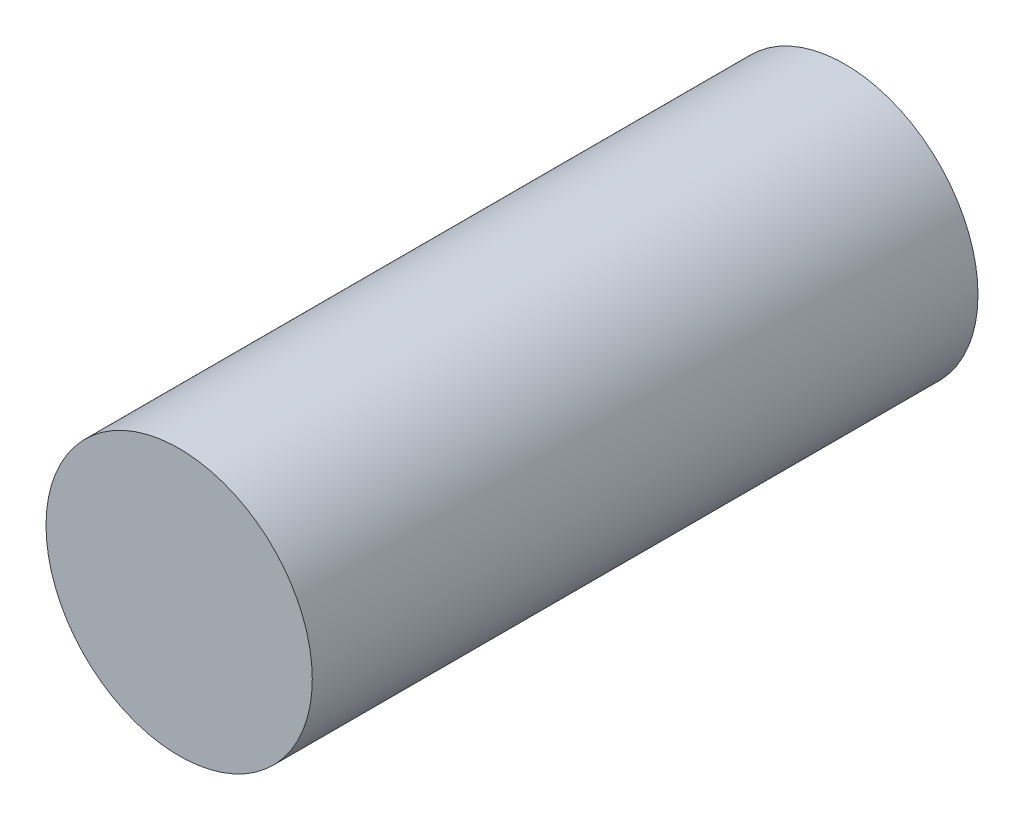
ISO-10303-21;
HEADER;
FILE_DESCRIPTION(('STEP AP214'),'2;1');
FILE_NAME('part.step','',(''),(''),'','','');
FILE_SCHEMA(('AUTOMOTIVE_DESIGN { 1 0 10303 214 1 1 1 1 }'));
ENDSEC;
DATA;
#1=APPLICATION_CONTEXT('core data for automotive mechanical design processes');
#2=APPLICATION_PROTOCOL_DEFINITION('international standard','automotive_design',2000,#1);
#3=PRODUCT_CONTEXT('',#1,'mechanical');
#4=PRODUCT('Part','Part','',(#3));
#5=PRODUCT_RELATED_PRODUCT_CATEGORY('part','',(#4));
#6=PRODUCT_DEFINITION_FORMATION('','',#4);
#7=PRODUCT_DEFINITION_CONTEXT('part definition',#1,'design');
#8=PRODUCT_DEFINITION('design','',#6,#7);
#9=PRODUCT_DEFINITION_SHAPE('','',#8);
#10=(LENGTH_UNIT() NAMED_UNIT(*) SI_UNIT(.MILLI.,.METRE.));
#11=(NAMED_UNIT(*) PLANE_ANGLE_UNIT() SI_UNIT($,.RADIAN.));
#12=(NAMED_UNIT(*) SI_UNIT($,.STERADIAN.) SOLID_ANGLE_UNIT());
#13=UNCERTAINTY_MEASURE_WITH_UNIT(LENGTH_MEASURE(1.E-05),#10,'distance_accuracy_value','');
#14=(GEOMETRIC_REPRESENTATION_CONTEXT(3) GLOBAL_UNCERTAINTY_ASSIGNED_CONTEXT((#13)) GLOBAL_UNIT_ASSIGNED_CONTEXT((#10,
#11,#12)) REPRESENTATION_CONTEXT('',''));
#15=CARTESIAN_POINT('',(0.,0.,0.));
#16=DIRECTION('',(0.,0.,1.));
#17=DIRECTION('',(1.,0.,0.));
#18=AXIS2_PLACEMENT_3D('',#15,#16,#17);
#19=CARTESIAN_POINT('',(0.,0.,11.90625));
#20=DIRECTION('',(0.,0.,-1.));
#21=DIRECTION('',(-1.,0.,0.));
#22=AXIS2_PLACEMENT_3D('',#19,#20,#21);
#23=CYLINDRICAL_SURFACE('',#22,4.7625);
#24=CARTESIAN_POINT('',(0.,0.,11.90625));
#25=DIRECTION('',(0.,0.,1.));
#26=DIRECTION('',(1.,0.,0.));
#27=AXIS2_PLACEMENT_3D('',#24,#25,#26);
#28=CIRCLE('',#27,4.7625);
#29=CARTESIAN_POINT('',(4.7625,0.,11.90625));
#30=VERTEX_POINT('',#29);
#31=EDGE_CURVE('E10',#30,#30,#28,.T.);
#32=ORIENTED_EDGE('',*,*,#31,.F.);
#33=EDGE_LOOP('',(#32));
#34=FACE_BOUND('',#33,.T.);
#35=CARTESIAN_POINT('',(0.,0.,-11.90625));
#36=DIRECTION('',(0.,0.,1.));
#37=DIRECTION('',(1.,0.,0.));
#38=AXIS2_PLACEMENT_3D('',#35,#36,#37);
#39=CIRCLE('',#38,4.7625);
#40=CARTESIAN_POINT('',(4.7625,0.,-11.90625));
#41=VERTEX_POINT('',#40);
#42=EDGE_CURVE('E34',#41,#41,#39,.T.);
#43=ORIENTED_EDGE('',*,*,#42,.T.);
#44=EDGE_LOOP('',(#43));
#45=FACE_BOUND('',#44,.T.);
#46=ADVANCED_FACE('F31',(#34,#45),#23,.T.);
#47=CARTESIAN_POINT('',(0.,0.,11.90625));
#48=DIRECTION('',(0.,0.,1.));
#49=DIRECTION('',(1.,0.,0.));
#50=AXIS2_PLACEMENT_3D('',#47,#48,#49);
#51=PLANE('',#50);
#52=ORIENTED_EDGE('',*,*,#31,.T.);
#53=EDGE_LOOP('',(#52));
#54=FACE_BOUND('',#53,.T.);
#55=ADVANCED_FACE('F46',(#54),#51,.T.);
#56=CARTESIAN_POINT('',(0.,0.,-11.90625));
#57=DIRECTION('',(0.,0.,1.));
#58=DIRECTION('',(1.,0.,0.));
#59=AXIS2_PLACEMENT_3D('',#56,#57,#58);
#60=PLANE('',#59);
#61=ORIENTED_EDGE('',*,*,#42,.F.);
#62=EDGE_LOOP('',(#61));
#63=FACE_BOUND('',#62,.T.);
#64=ADVANCED_FACE('F44',(#63),#60,.F.);
#65=CLOSED_SHELL('',(#46,#55,#64));
#66=MANIFOLD_SOLID_BREP('B2',#65);
#67=ADVANCED_BREP_SHAPE_REPRESENTATION('',(#18,#66),#14);
#68=SHAPE_DEFINITION_REPRESENTATION(#9,#67);
ENDSEC;
END-ISO-10303-21;
